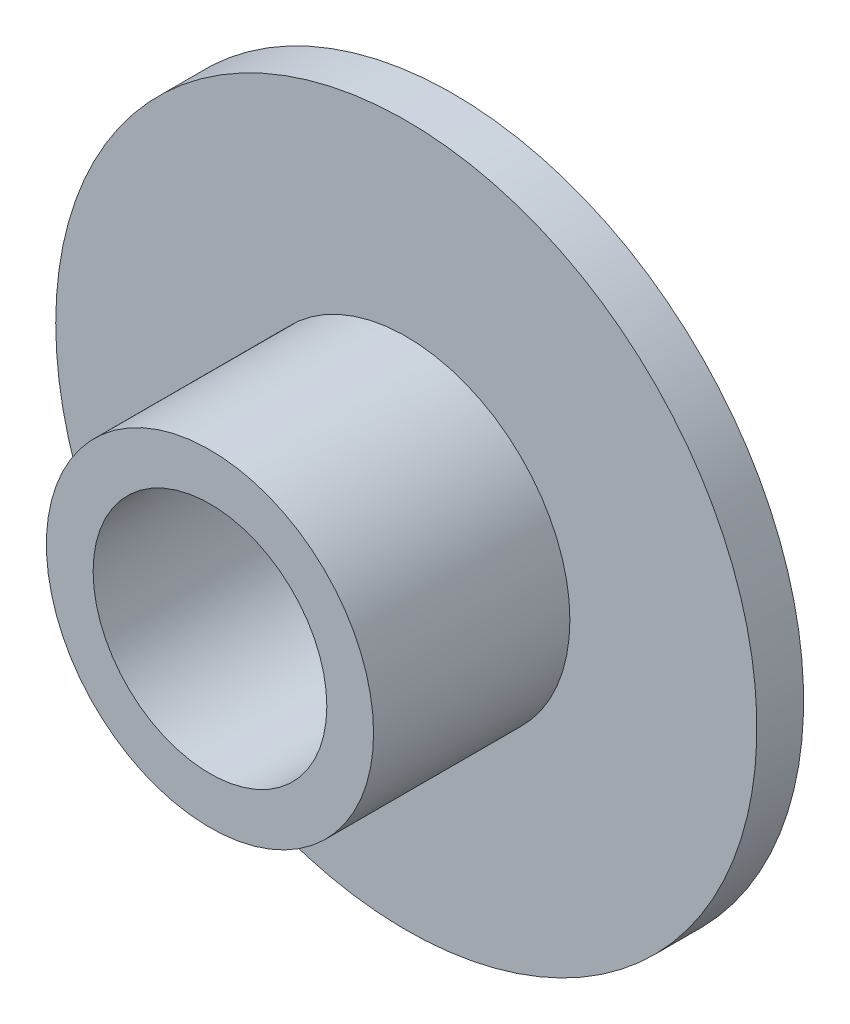
ISO-10303-21;
HEADER;
FILE_DESCRIPTION(('STEP AP214'),'2;1');
FILE_NAME('part.step','',(''),(''),'','','');
FILE_SCHEMA(('AUTOMOTIVE_DESIGN { 1 0 10303 214 1 1 1 1 }'));
ENDSEC;
DATA;
#1=APPLICATION_CONTEXT('core data for automotive mechanical design processes');
#2=APPLICATION_PROTOCOL_DEFINITION('international standard','automotive_design',2000,#1);
#3=PRODUCT_CONTEXT('',#1,'mechanical');
#4=PRODUCT('Part','Part','',(#3));
#5=PRODUCT_RELATED_PRODUCT_CATEGORY('part','',(#4));
#6=PRODUCT_DEFINITION_FORMATION('','',#4);
#7=PRODUCT_DEFINITION_CONTEXT('part definition',#1,'design');
#8=PRODUCT_DEFINITION('design','',#6,#7);
#9=PRODUCT_DEFINITION_SHAPE('','',#8);
#10=(LENGTH_UNIT() NAMED_UNIT(*) SI_UNIT(.MILLI.,.METRE.));
#11=(NAMED_UNIT(*) PLANE_ANGLE_UNIT() SI_UNIT($,.RADIAN.));
#12=(NAMED_UNIT(*) SI_UNIT($,.STERADIAN.) SOLID_ANGLE_UNIT());
#13=UNCERTAINTY_MEASURE_WITH_UNIT(LENGTH_MEASURE(1.E-05),#10,'distance_accuracy_value','');
#14=(GEOMETRIC_REPRESENTATION_CONTEXT(3) GLOBAL_UNCERTAINTY_ASSIGNED_CONTEXT((#13)) GLOBAL_UNIT_ASSIGNED_CONTEXT((#10,
#11,#12)) REPRESENTATION_CONTEXT('',''));
#15=CARTESIAN_POINT('',(0.,0.,0.));
#16=DIRECTION('',(0.,0.,1.));
#17=DIRECTION('',(1.,0.,0.));
#18=AXIS2_PLACEMENT_3D('',#15,#16,#17);
#19=CARTESIAN_POINT('',(0.,0.,4.19999999999998));
#20=DIRECTION('',(0.,0.,1.));
#21=DIRECTION('',(1.,0.,0.));
#22=AXIS2_PLACEMENT_3D('',#19,#20,#21);
#23=PLANE('',#22);
#24=CARTESIAN_POINT('',(0.,0.,4.19999999999998));
#25=DIRECTION('',(0.,0.,1.));
#26=DIRECTION('',(1.,0.,0.));
#27=AXIS2_PLACEMENT_3D('',#24,#25,#26);
#28=CIRCLE('',#27,3.5);
#29=CARTESIAN_POINT('',(3.5,0.,4.19999999999998));
#30=VERTEX_POINT('',#29);
#31=EDGE_CURVE('E10',#30,#30,#28,.T.);
#32=ORIENTED_EDGE('',*,*,#31,.T.);
#33=EDGE_LOOP('',(#32));
#34=FACE_BOUND('',#33,.T.);
#35=CARTESIAN_POINT('',(0.,0.,4.19999999999998));
#36=DIRECTION('',(0.,0.,1.));
#37=DIRECTION('',(1.,0.,0.));
#38=AXIS2_PLACEMENT_3D('',#35,#36,#37);
#39=CIRCLE('',#38,2.5);
#40=CARTESIAN_POINT('',(2.5,0.,4.19999999999998));
#41=VERTEX_POINT('',#40);
#42=EDGE_CURVE('E59',#41,#41,#39,.T.);
#43=ORIENTED_EDGE('',*,*,#42,.F.);
#44=EDGE_LOOP('',(#43));
#45=FACE_BOUND('',#44,.T.);
#46=ADVANCED_FACE('F50',(#34,#45),#23,.T.);
#47=CARTESIAN_POINT('',(0.,0.,4.19999999999998));
#48=DIRECTION('',(0.,0.,-1.));
#49=DIRECTION('',(-1.,0.,0.));
#50=AXIS2_PLACEMENT_3D('',#47,#48,#49);
#51=CYLINDRICAL_SURFACE('',#50,3.5);
#52=ORIENTED_EDGE('',*,*,#31,.F.);
#53=EDGE_LOOP('',(#52));
#54=FACE_BOUND('',#53,.T.);
#55=CARTESIAN_POINT('',(0.,0.,0.));
#56=DIRECTION('',(0.,0.,1.));
#57=DIRECTION('',(1.,0.,0.));
#58=AXIS2_PLACEMENT_3D('',#55,#56,#57);
#59=CIRCLE('',#58,3.5);
#60=CARTESIAN_POINT('',(3.5,0.,0.));
#61=VERTEX_POINT('',#60);
#62=EDGE_CURVE('E54',#61,#61,#59,.T.);
#63=ORIENTED_EDGE('',*,*,#62,.T.);
#64=EDGE_LOOP('',(#63));
#65=FACE_BOUND('',#64,.T.);
#66=ADVANCED_FACE('F52',(#54,#65),#51,.T.);
#67=CARTESIAN_POINT('',(0.,0.,4.19999999999998));
#68=DIRECTION('',(0.,0.,-1.));
#69=DIRECTION('',(-1.,0.,0.));
#70=AXIS2_PLACEMENT_3D('',#67,#68,#69);
#71=CYLINDRICAL_SURFACE('',#70,2.5);
#72=ORIENTED_EDGE('',*,*,#42,.T.);
#73=EDGE_LOOP('',(#72));
#74=FACE_BOUND('',#73,.T.);
#75=CARTESIAN_POINT('',(0.,0.,-1.));
#76=DIRECTION('',(0.,0.,-1.));
#77=DIRECTION('',(-1.,0.,0.));
#78=AXIS2_PLACEMENT_3D('',#75,#76,#77);
#79=CIRCLE('',#78,2.5);
#80=CARTESIAN_POINT('',(-2.5,0.,-1.));
#81=VERTEX_POINT('',#80);
#82=EDGE_CURVE('E72',#81,#81,#79,.T.);
#83=ORIENTED_EDGE('',*,*,#82,.T.);
#84=EDGE_LOOP('',(#83));
#85=FACE_BOUND('',#84,.T.);
#86=ADVANCED_FACE('F81',(#74,#85),#71,.F.);
#87=CARTESIAN_POINT('',(0.,0.,-1.));
#88=DIRECTION('',(0.,0.,-1.));
#89=DIRECTION('',(-1.,0.,0.));
#90=AXIS2_PLACEMENT_3D('',#87,#88,#89);
#91=PLANE('',#90);
#92=CARTESIAN_POINT('',(0.,0.,-1.));
#93=DIRECTION('',(0.,0.,-1.));
#94=DIRECTION('',(-1.,0.,0.));
#95=AXIS2_PLACEMENT_3D('',#92,#93,#94);
#96=CIRCLE('',#95,7.5);
#97=CARTESIAN_POINT('',(-7.5,0.,-1.));
#98=VERTEX_POINT('',#97);
#99=EDGE_CURVE('E71',#98,#98,#96,.T.);
#100=ORIENTED_EDGE('',*,*,#99,.T.);
#101=EDGE_LOOP('',(#100));
#102=FACE_BOUND('',#101,.T.);
#103=ORIENTED_EDGE('',*,*,#82,.F.);
#104=EDGE_LOOP('',(#103));
#105=FACE_BOUND('',#104,.T.);
#106=ADVANCED_FACE('F83',(#102,#105),#91,.T.);
#107=CARTESIAN_POINT('',(0.,0.,0.));
#108=DIRECTION('',(0.,0.,-1.));
#109=DIRECTION('',(-1.,0.,0.));
#110=AXIS2_PLACEMENT_3D('',#107,#108,#109);
#111=PLANE('',#110);
#112=ORIENTED_EDGE('',*,*,#62,.F.);
#113=EDGE_LOOP('',(#112));
#114=FACE_BOUND('',#113,.T.);
#115=CARTESIAN_POINT('',(0.,0.,0.));
#116=DIRECTION('',(0.,0.,-1.));
#117=DIRECTION('',(-1.,0.,0.));
#118=AXIS2_PLACEMENT_3D('',#115,#116,#117);
#119=CIRCLE('',#118,7.5);
#120=CARTESIAN_POINT('',(-7.5,0.,0.));
#121=VERTEX_POINT('',#120);
#122=EDGE_CURVE('E67',#121,#121,#119,.T.);
#123=ORIENTED_EDGE('',*,*,#122,.F.);
#124=EDGE_LOOP('',(#123));
#125=FACE_BOUND('',#124,.T.);
#126=ADVANCED_FACE('F85',(#114,#125),#111,.F.);
#127=CARTESIAN_POINT('',(0.,0.,-1.));
#128=DIRECTION('',(0.,0.,1.));
#129=DIRECTION('',(1.,0.,0.));
#130=AXIS2_PLACEMENT_3D('',#127,#128,#129);
#131=CYLINDRICAL_SURFACE('',#130,7.5);
#132=ORIENTED_EDGE('',*,*,#99,.F.);
#133=EDGE_LOOP('',(#132));
#134=FACE_BOUND('',#133,.T.);
#135=ORIENTED_EDGE('',*,*,#122,.T.);
#136=EDGE_LOOP('',(#135));
#137=FACE_BOUND('',#136,.T.);
#138=ADVANCED_FACE('F92',(#134,#137),#131,.T.);
#139=CLOSED_SHELL('',(#46,#66,#86,#106,#126,#138));
#140=MANIFOLD_SOLID_BREP('B2',#139);
#141=ADVANCED_BREP_SHAPE_REPRESENTATION('',(#18,#140),#14);
#142=SHAPE_DEFINITION_REPRESENTATION(#9,#141);
ENDSEC;
END-ISO-10303-21;
